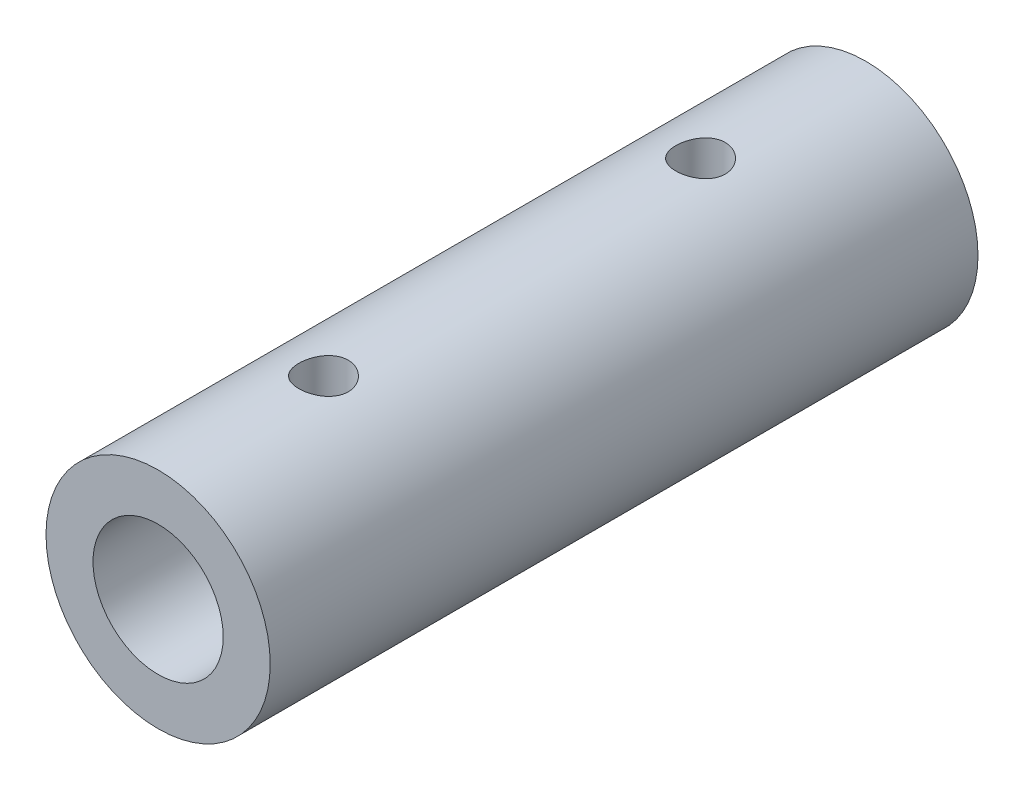
ISO-10303-21;
HEADER;
FILE_DESCRIPTION(('STEP AP214'),'2;1');
FILE_NAME('part.step','',(''),(''),'','','');
FILE_SCHEMA(('AUTOMOTIVE_DESIGN { 1 0 10303 214 1 1 1 1 }'));
ENDSEC;
DATA;
#1=APPLICATION_CONTEXT('core data for automotive mechanical design processes');
#2=APPLICATION_PROTOCOL_DEFINITION('international standard','automotive_design',2000,#1);
#3=PRODUCT_CONTEXT('',#1,'mechanical');
#4=PRODUCT('Part','Part','',(#3));
#5=PRODUCT_RELATED_PRODUCT_CATEGORY('part','',(#4));
#6=PRODUCT_DEFINITION_FORMATION('','',#4);
#7=PRODUCT_DEFINITION_CONTEXT('part definition',#1,'design');
#8=PRODUCT_DEFINITION('design','',#6,#7);
#9=PRODUCT_DEFINITION_SHAPE('','',#8);
#10=(LENGTH_UNIT() NAMED_UNIT(*) SI_UNIT(.MILLI.,.METRE.));
#11=(NAMED_UNIT(*) PLANE_ANGLE_UNIT() SI_UNIT($,.RADIAN.));
#12=(NAMED_UNIT(*) SI_UNIT($,.STERADIAN.) SOLID_ANGLE_UNIT());
#13=UNCERTAINTY_MEASURE_WITH_UNIT(LENGTH_MEASURE(1.E-05),#10,'distance_accuracy_value','');
#14=(GEOMETRIC_REPRESENTATION_CONTEXT(3) GLOBAL_UNCERTAINTY_ASSIGNED_CONTEXT((#13)) GLOBAL_UNIT_ASSIGNED_CONTEXT((#10,
#11,#12)) REPRESENTATION_CONTEXT('',''));
#15=CARTESIAN_POINT('',(0.,0.,0.));
#16=DIRECTION('',(0.,0.,1.));
#17=DIRECTION('',(1.,0.,0.));
#18=AXIS2_PLACEMENT_3D('',#15,#16,#17);
#19=CARTESIAN_POINT('',(0.,0.,54.356));
#20=DIRECTION('',(0.,0.,1.));
#21=DIRECTION('',(1.,0.,0.));
#22=AXIS2_PLACEMENT_3D('',#19,#20,#21);
#23=PLANE('',#22);
#24=CARTESIAN_POINT('',(0.,0.,54.356));
#25=DIRECTION('',(0.,0.,1.));
#26=DIRECTION('',(1.,0.,0.));
#27=AXIS2_PLACEMENT_3D('',#24,#25,#26);
#28=CIRCLE('',#27,8.610000052);
#29=CARTESIAN_POINT('',(8.610000052,0.,54.356));
#30=VERTEX_POINT('',#29);
#31=EDGE_CURVE('E66',#30,#30,#28,.T.);
#32=ORIENTED_EDGE('',*,*,#31,.T.);
#33=EDGE_LOOP('',(#32));
#34=FACE_BOUND('',#33,.T.);
#35=CARTESIAN_POINT('',(0.,0.,54.356));
#36=DIRECTION('',(0.,0.,1.));
#37=DIRECTION('',(1.,0.,0.));
#38=AXIS2_PLACEMENT_3D('',#35,#36,#37);
#39=CIRCLE('',#38,4.999999906);
#40=CARTESIAN_POINT('',(4.999999906,0.,54.356));
#41=VERTEX_POINT('',#40);
#42=EDGE_CURVE('E130',#41,#41,#39,.T.);
#43=ORIENTED_EDGE('',*,*,#42,.F.);
#44=EDGE_LOOP('',(#43));
#45=FACE_BOUND('',#44,.T.);
#46=ADVANCED_FACE('F43',(#34,#45),#23,.T.);
#47=CARTESIAN_POINT('',(0.,0.,0.));
#48=DIRECTION('',(0.,0.,1.));
#49=DIRECTION('',(1.,0.,0.));
#50=AXIS2_PLACEMENT_3D('',#47,#48,#49);
#51=PLANE('',#50);
#52=CARTESIAN_POINT('',(0.,0.,0.));
#53=DIRECTION('',(0.,0.,1.));
#54=DIRECTION('',(1.,0.,0.));
#55=AXIS2_PLACEMENT_3D('',#52,#53,#54);
#56=CIRCLE('',#55,8.610000052);
#57=CARTESIAN_POINT('',(8.610000052,0.,0.));
#58=VERTEX_POINT('',#57);
#59=EDGE_CURVE('E124',#58,#58,#56,.T.);
#60=ORIENTED_EDGE('',*,*,#59,.F.);
#61=EDGE_LOOP('',(#60));
#62=FACE_BOUND('',#61,.T.);
#63=CARTESIAN_POINT('',(0.,0.,0.));
#64=DIRECTION('',(0.,0.,1.));
#65=DIRECTION('',(1.,0.,0.));
#66=AXIS2_PLACEMENT_3D('',#63,#64,#65);
#67=CIRCLE('',#66,4.999999906);
#68=CARTESIAN_POINT('',(4.999999906,0.,0.));
#69=VERTEX_POINT('',#68);
#70=EDGE_CURVE('E127',#69,#69,#67,.T.);
#71=ORIENTED_EDGE('',*,*,#70,.T.);
#72=EDGE_LOOP('',(#71));
#73=FACE_BOUND('',#72,.T.);
#74=ADVANCED_FACE('F113',(#62,#73),#51,.F.);
#75=CARTESIAN_POINT('',(0.,0.,54.356));
#76=DIRECTION('',(0.,0.,-1.));
#77=DIRECTION('',(-1.,0.,0.));
#78=AXIS2_PLACEMENT_3D('',#75,#76,#77);
#79=CYLINDRICAL_SURFACE('',#78,8.610000052);
#80=CARTESIAN_POINT('',(0.,-8.610000052,44.11345));
#81=CARTESIAN_POINT('',(0.135110235487046,-8.60999843787346,44.1134476024806));
#82=CARTESIAN_POINT('',(0.270245136241255,-8.60678896456518,44.1022703393886));
#83=CARTESIAN_POINT('',(0.536598644479173,-8.59429840560888,44.0579504820702));
#84=CARTESIAN_POINT('',(0.667815743718076,-8.58501501239633,44.0247995396824));
#85=CARTESIAN_POINT('',(0.922452183889428,-8.56139719241706,43.9377154809111));
#86=CARTESIAN_POINT('',(1.04588210638935,-8.54706980193344,43.8838113051512));
#87=CARTESIAN_POINT('',(1.28195111823434,-8.51486432246543,43.7568645304906));
#88=CARTESIAN_POINT('',(1.39458908328752,-8.49698586413042,43.6838199405209));
#89=CARTESIAN_POINT('',(1.60883247864422,-8.45907115321718,43.5186441536598));
#90=CARTESIAN_POINT('',(1.71011452866295,-8.43899391197681,43.4261029302473));
#91=CARTESIAN_POINT('',(1.89595301088498,-8.39919721681434,43.2254357970887));
#92=CARTESIAN_POINT('',(1.98050694116524,-8.37947781681234,43.1173075602621));
#93=CARTESIAN_POINT('',(2.13213384884984,-8.34220249619708,42.8858696957101));
#94=CARTESIAN_POINT('',(2.19882239190662,-8.32469787356624,42.7622991747185));
#95=CARTESIAN_POINT('',(2.31034446668434,-8.29444223189009,42.5051179818037));
#96=CARTESIAN_POINT('',(2.35518268905458,-8.28169019273717,42.3715094718686));
#97=CARTESIAN_POINT('',(2.42058456830036,-8.26280891927936,42.1016546530029));
#98=CARTESIAN_POINT('',(2.44174006751581,-8.25651855304008,41.9655633465747));
#99=CARTESIAN_POINT('',(2.46102285204839,-8.25079253424646,41.6916290175342));
#100=CARTESIAN_POINT('',(2.45915512963058,-8.25135539566479,41.5537863811488));
#101=CARTESIAN_POINT('',(2.4329115907966,-8.25912878817347,41.284986037917));
#102=CARTESIAN_POINT('',(2.4092655701133,-8.26612376545237,41.1539498324697));
#103=CARTESIAN_POINT('',(2.34131114051683,-8.28562612800992,40.8977871286055));
#104=CARTESIAN_POINT('',(2.29700086712936,-8.2981340106961,40.7726611645743));
#105=CARTESIAN_POINT('',(2.18841279106031,-8.32743268516131,40.5300331824734));
#106=CARTESIAN_POINT('',(2.12388973977514,-8.34427560158148,40.4126474871901));
#107=CARTESIAN_POINT('',(1.97687837832189,-8.38032019086892,40.1901196222558));
#108=CARTESIAN_POINT('',(1.89438607597686,-8.39952238747676,40.0849801812988));
#109=CARTESIAN_POINT('',(1.71010502466155,-8.43900659057232,39.8857759361051));
#110=CARTESIAN_POINT('',(1.60770729167331,-8.45930204889059,39.7922762699486));
#111=CARTESIAN_POINT('',(1.38843403453033,-8.49804269417671,39.6236514561524));
#112=CARTESIAN_POINT('',(1.27155776363307,-8.51648778562149,39.5485272568375));
#113=CARTESIAN_POINT('',(1.02568681516523,-8.54959176332535,39.41848599062));
#114=CARTESIAN_POINT('',(0.896628249546233,-8.56422898277711,39.3636838365675));
#115=CARTESIAN_POINT('',(0.630613786129785,-8.58791185632248,39.2767239530241));
#116=CARTESIAN_POINT('',(0.493659884002574,-8.59695891670027,39.2445605281548));
#117=CARTESIAN_POINT('',(0.220555049493647,-8.60822405481961,39.2047077344697));
#118=CARTESIAN_POINT('',(0.0845246920708002,-8.61065606338982,39.1962513907367));
#119=CARTESIAN_POINT('',(-0.187015195192118,-8.60903903495696,39.2019173435546));
#120=CARTESIAN_POINT('',(-0.322524785438475,-8.60499077386318,39.2160369369957));
#121=CARTESIAN_POINT('',(-0.586352654071624,-8.59100736009443,39.2658294269295));
#122=CARTESIAN_POINT('',(-0.714760735224726,-8.5811921855351,39.3010633388608));
#123=CARTESIAN_POINT('',(-0.963822748771201,-8.55679956013814,39.3915644636817));
#124=CARTESIAN_POINT('',(-1.0844757833262,-8.5422215590698,39.4468339912884));
#125=CARTESIAN_POINT('',(-1.31749651064028,-8.50943348003594,39.5771852093947));
#126=CARTESIAN_POINT('',(-1.42962872608689,-8.4911517013415,39.6526693426578));
#127=CARTESIAN_POINT('',(-1.63989992678921,-8.45306257497311,39.8208106479166));
#128=CARTESIAN_POINT('',(-1.73803572654746,-8.43325488158527,39.913471718276));
#129=CARTESIAN_POINT('',(-1.92084170557701,-8.39354010485391,40.1169315788528));
#130=CARTESIAN_POINT('',(-2.00496789434801,-8.37365087523657,40.2282236183542));
#131=CARTESIAN_POINT('',(-2.15337670330665,-8.33672236397252,40.4637740500766));
#132=CARTESIAN_POINT('',(-2.21766001676352,-8.31968298276752,40.5880319890929));
#133=CARTESIAN_POINT('',(-2.32408921984882,-8.29058243734992,40.8454695384306));
#134=CARTESIAN_POINT('',(-2.36635265956832,-8.2784949139034,40.9785974045999));
#135=CARTESIAN_POINT('',(-2.42776102610443,-8.26069725314294,41.2504824753168));
#136=CARTESIAN_POINT('',(-2.44691293993981,-8.25498518845546,41.3892379654169));
#137=CARTESIAN_POINT('',(-2.46111137651616,-8.25076233740564,41.6628264083924));
#138=CARTESIAN_POINT('',(-2.45703879547907,-8.25198837752461,41.7976102184914));
#139=CARTESIAN_POINT('',(-2.42697983520207,-8.26087829053974,42.0644843417645));
#140=CARTESIAN_POINT('',(-2.4009941843591,-8.26854194944751,42.1965747443188));
#141=CARTESIAN_POINT('',(-2.32839029768394,-8.28927573653278,42.4530224047454));
#142=CARTESIAN_POINT('',(-2.28198430079094,-8.30229016243034,42.5774445794313));
#143=CARTESIAN_POINT('',(-2.17002119482443,-8.33225373446898,42.8168351999697));
#144=CARTESIAN_POINT('',(-2.10446070223758,-8.34920357566611,42.9318019709866));
#145=CARTESIAN_POINT('',(-1.9534878892542,-8.38583338791318,43.153159349927));
#146=CARTESIAN_POINT('',(-1.86748684990437,-8.40558551321868,43.2591365165472));
#147=CARTESIAN_POINT('',(-1.67916076592766,-8.44522141888343,43.4554408450375));
#148=CARTESIAN_POINT('',(-1.57683161893758,-8.46510523112188,43.5457640619947));
#149=CARTESIAN_POINT('',(-1.35559781639118,-8.50337343733367,43.7104863824259));
#150=CARTESIAN_POINT('',(-1.23633607375684,-8.52170645588591,43.7844189669412));
#151=CARTESIAN_POINT('',(-0.986552704546226,-8.55421721226658,43.9110736487339));
#152=CARTESIAN_POINT('',(-0.856037296273841,-8.56839722606612,43.9638073695504));
#153=CARTESIAN_POINT('',(-0.605292131128479,-8.58949401620546,44.0408571715148));
#154=CARTESIAN_POINT('',(-0.485987265747071,-8.59712370058352,44.0680106286004));
#155=CARTESIAN_POINT('',(-0.24446140330883,-8.60737711535723,44.1043069282104));
#156=CARTESIAN_POINT('',(-0.122240796778708,-8.61000151237873,44.1134521691524));
#157=CARTESIAN_POINT('',(0.,-8.610000052,44.11345));
#158=B_SPLINE_CURVE_WITH_KNOTS('',3,(#80,#81,#82,#83,#84,#85,#86,#87,#88,#89,#90,#91,#92,#93,
#94,#95,#96,#97,#98,#99,#100,#101,#102,#103,#104,#105,#106,#107,#108,#109,#110,#111,#112,#113,
#114,#115,#116,#117,#118,#119,#120,#121,#122,#123,#124,#125,#126,#127,#128,#129,#130,#131,#132,
#133,#134,#135,#136,#137,#138,#139,#140,#141,#142,#143,#144,#145,#146,#147,#148,#149,#150,#151,
#152,#153,#154,#155,#156,#157),.UNSPECIFIED.,.T.,.F.,(4,2,2,2,2,2,2,2,2,2,2,2,2,2,2,2,2,2,2,2,2,
2,2,2,2,2,2,2,2,2,2,2,2,2,2,2,2,2,4),(0.,0.404882020788605,0.80991795113376,1.21439108816756,
1.61890631696577,2.03297497344574,2.44710551291364,2.86953838456116,3.29188053176022,
3.70341458920873,4.11485941279647,4.51299937322733,4.91117526359957,5.31438279728944,
5.71768000196978,6.13614308957469,6.55462776875096,6.97544397238729,7.39615427056462,
7.80308730589802,8.20997162111288,8.60867648164454,9.0074274192847,9.41479793611352,
9.82226102049825,10.2430220954495,10.6637684682106,11.0822451159685,11.5005952191916,
11.9031856446707,12.3057626884522,12.7042508908905,13.102809526202,13.5146492364446,
13.9265925829515,14.3490750115578,14.7713254720157,15.1376907121345,15.5040071547353),.UNSPECIFIED.);
#159=CARTESIAN_POINT('',(0.,-8.610000052,44.11345));
#160=VERTEX_POINT('',#159);
#161=EDGE_CURVE('E10',#160,#160,#158,.T.);
#162=ORIENTED_EDGE('',*,*,#161,.T.);
#163=EDGE_LOOP('',(#162));
#164=FACE_BOUND('',#163,.T.);
#165=CARTESIAN_POINT('',(0.,8.610000052,10.80135));
#166=CARTESIAN_POINT('',(0.105282423967709,8.60999811333202,10.8013535651746));
#167=CARTESIAN_POINT('',(0.210607741396535,8.60804937116556,10.8101366152437));
#168=CARTESIAN_POINT('',(0.418265187752237,8.60046370971147,10.8449994156247));
#169=CARTESIAN_POINT('',(0.520595148325115,8.5948241844162,10.8710913876894));
#170=CARTESIAN_POINT('',(0.719230912876964,8.58048468968561,10.9397139055741));
#171=CARTESIAN_POINT('',(0.81554293741652,8.57178794417312,10.982227139369));
#172=CARTESIAN_POINT('',(0.999663953566136,8.55227195774755,11.0824301147066));
#173=CARTESIAN_POINT('',(1.08747313709988,8.54145276475843,11.1401195135879));
#174=CARTESIAN_POINT('',(1.25352987169506,8.51867942267443,11.2700319083504));
#175=CARTESIAN_POINT('',(1.33161904562148,8.50671100539432,11.3424548611404));
#176=CARTESIAN_POINT('',(1.47464564562941,8.4830883480796,11.4993493346095));
#177=CARTESIAN_POINT('',(1.53958188363856,8.47143413650878,11.5838219425309));
#178=CARTESIAN_POINT('',(1.65516055359782,8.44961858040989,11.7635920243789));
#179=CARTESIAN_POINT('',(1.70563392054591,8.43947551021091,11.8590006103153));
#180=CARTESIAN_POINT('',(1.78976948026943,8.42203565167347,12.057206157304));
#181=CARTESIAN_POINT('',(1.82343371867,8.41473851701608,12.1600022175781));
#182=CARTESIAN_POINT('',(1.87247108317844,8.40396212355281,12.3683453860998));
#183=CARTESIAN_POINT('',(1.88812486054031,8.40042435238324,12.47382334641));
#184=CARTESIAN_POINT('',(1.90156968458316,8.39739154378867,12.6859631123958));
#185=CARTESIAN_POINT('',(1.89936296428083,8.39789600098219,12.7926247684143));
#186=CARTESIAN_POINT('',(1.87737518111768,8.40283769889481,13.0020143577812));
#187=CARTESIAN_POINT('',(1.85792058907767,8.40720187837269,13.1047785595015));
#188=CARTESIAN_POINT('',(1.80250672752471,8.41925572451525,13.3055476997296));
#189=CARTESIAN_POINT('',(1.76654651839497,8.42694558049958,13.4035523669397));
#190=CARTESIAN_POINT('',(1.67884360712381,8.44485605493333,13.5929359353832));
#191=CARTESIAN_POINT('',(1.62697575537806,8.45509661590689,13.6842549156791));
#192=CARTESIAN_POINT('',(1.50901786770477,8.47694246920617,13.8570137005531));
#193=CARTESIAN_POINT('',(1.44292586297509,8.48854795035311,13.9384521350965));
#194=CARTESIAN_POINT('',(1.29666960655667,8.51212916249091,14.0910172334709));
#195=CARTESIAN_POINT('',(1.2162278552335,8.52410742319792,14.1618777481698));
#196=CARTESIAN_POINT('',(1.04446655699098,8.54685225570169,14.2891463527741));
#197=CARTESIAN_POINT('',(0.953146806741693,8.55761880484199,14.3455541724697));
#198=CARTESIAN_POINT('',(0.761893937788416,8.57676297038531,14.4423836338736));
#199=CARTESIAN_POINT('',(0.661942372038452,8.58513529693755,14.4827699523298));
#200=CARTESIAN_POINT('',(0.456445799026004,8.59850842278644,14.5460997325734));
#201=CARTESIAN_POINT('',(0.350901621285715,8.60350972058827,14.5690457734799));
#202=CARTESIAN_POINT('',(0.139498379534734,8.60950617009743,14.5964554948651));
#203=CARTESIAN_POINT('',(0.0336886170886337,8.61058010098827,14.6012826750786));
#204=CARTESIAN_POINT('',(-0.177225458159257,8.6088217689155,14.5933035296943));
#205=CARTESIAN_POINT('',(-0.282329819134173,8.60598977547902,14.5804984208072));
#206=CARTESIAN_POINT('',(-0.487642008430828,8.59678756118083,14.5379195224936));
#207=CARTESIAN_POINT('',(-0.587891407265301,8.59045720153258,14.5083368032034));
#208=CARTESIAN_POINT('',(-0.782004911865495,8.57496698955335,14.4332548397273));
#209=CARTESIAN_POINT('',(-0.875868466692472,8.56580689346364,14.3877542242995));
#210=CARTESIAN_POINT('',(-1.05604587278676,8.54547922212635,14.2813735716998));
#211=CARTESIAN_POINT('',(-1.14223082994206,8.5342845171704,14.2202805258222));
#212=CARTESIAN_POINT('',(-1.30325591748071,8.51118403478381,14.0847292605493));
#213=CARTESIAN_POINT('',(-1.37809454612002,8.4992781635169,14.0102692748154));
#214=CARTESIAN_POINT('',(-1.51574305200032,8.47582447649938,13.8484285636673));
#215=CARTESIAN_POINT('',(-1.57830102599006,8.46428756286024,13.7608317150569));
#216=CARTESIAN_POINT('',(-1.68781947754207,8.44313271481403,13.5761618694889));
#217=CARTESIAN_POINT('',(-1.73478063351321,8.43351469694873,13.4790892849314));
#218=CARTESIAN_POINT('',(-1.81145275115654,8.41737941266761,13.2787459309041));
#219=CARTESIAN_POINT('',(-1.84126126718999,8.41084464952885,13.1755139747427));
#220=CARTESIAN_POINT('',(-1.88306652655597,8.40158486273038,12.9653434852814));
#221=CARTESIAN_POINT('',(-1.89506617214383,8.39885921831486,12.8584055588393));
#222=CARTESIAN_POINT('',(-1.90078797415552,8.39756584736436,12.6463997481163));
#223=CARTESIAN_POINT('',(-1.89490968911294,8.39890722383784,12.5413430055343));
#224=CARTESIAN_POINT('',(-1.86593688073885,8.40539093738595,12.333756653401));
#225=CARTESIAN_POINT('',(-1.84284256722809,8.41053322813683,12.2312270130663));
#226=CARTESIAN_POINT('',(-1.78028773181278,8.42399469815741,12.0319290004177));
#227=CARTESIAN_POINT('',(-1.74088626878374,8.43230240485053,11.9351412645743));
#228=CARTESIAN_POINT('',(-1.64688599636683,8.45116295836884,11.7494910284576));
#229=CARTESIAN_POINT('',(-1.59228557378437,8.46171604348708,11.6606293707689));
#230=CARTESIAN_POINT('',(-1.46811596253354,8.48414915161104,11.4913861392531));
#231=CARTESIAN_POINT('',(-1.39826241650078,8.49605197305515,11.4112161737778));
#232=CARTESIAN_POINT('',(-1.24614454147193,8.51969119076192,11.2636050924168));
#233=CARTESIAN_POINT('',(-1.16387734459835,8.53142754787974,11.196166926035));
#234=CARTESIAN_POINT('',(-0.987955273489512,8.55359575023221,11.0750784231663));
#235=CARTESIAN_POINT('',(-0.894164106741991,8.56400827673821,11.0216223593719));
#236=CARTESIAN_POINT('',(-0.698717343847975,8.58216133429937,10.9313186041776));
#237=CARTESIAN_POINT('',(-0.597068375544788,8.5899040877716,10.8944570910139));
#238=CARTESIAN_POINT('',(-0.41277655996068,8.60047625352117,10.8449000825776));
#239=CARTESIAN_POINT('',(-0.331124979079468,8.60402543015327,10.8286001762217));
#240=CARTESIAN_POINT('',(-0.166324476867508,8.60878804181377,10.8068239739854));
#241=CARTESIAN_POINT('',(-0.0831756241459135,8.61000158359391,10.8013471834271));
#242=CARTESIAN_POINT('',(0.,8.610000052,10.80135));
#243=B_SPLINE_CURVE_WITH_KNOTS('',3,(#165,#166,#167,#168,#169,#170,#171,#172,#173,#174,#175,
#176,#177,#178,#179,#180,#181,#182,#183,#184,#185,#186,#187,#188,#189,#190,#191,#192,#193,#194,
#195,#196,#197,#198,#199,#200,#201,#202,#203,#204,#205,#206,#207,#208,#209,#210,#211,#212,#213,
#214,#215,#216,#217,#218,#219,#220,#221,#222,#223,#224,#225,#226,#227,#228,#229,#230,#231,#232,
#233,#234,#235,#236,#237,#238,#239,#240,#241,#242),.UNSPECIFIED.,.T.,.F.,(4,2,2,2,2,2,2,2,2,2,2,
2,2,2,2,2,2,2,2,2,2,2,2,2,2,2,2,2,2,2,2,2,2,2,2,2,2,2,4),(0.,0.31554279722232,0.631308635297217,
0.946742483574757,1.26216921030953,1.58220272526634,1.9022651351849,2.22592908401172,
2.54955363421196,2.86806387165592,3.18653428783056,3.49910235499884,3.81168821796569,
4.12679925597287,4.44195393740396,4.76403916326981,5.08613041044964,5.40892789033121,
5.73167762468735,6.0479166579306,6.36413387028656,6.6768201771624,6.98953342693099,
7.30677153586495,7.62405159628278,7.947281806446,8.27049795534575,8.59185718976975,
8.91316404754184,9.22734310463676,9.54151833272955,9.85456554736162,10.1676460010291,
10.4871555125838,10.8067389525139,11.1305516266044,11.454094092675,11.7033918174488,
11.9526781476321),.UNSPECIFIED.);
#244=CARTESIAN_POINT('',(0.,8.610000052,10.80135));
#245=VERTEX_POINT('',#244);
#246=EDGE_CURVE('E56',#245,#245,#243,.T.);
#247=ORIENTED_EDGE('',*,*,#246,.T.);
#248=EDGE_LOOP('',(#247));
#249=FACE_BOUND('',#248,.T.);
#250=CARTESIAN_POINT('',(0.,8.610000052,39.75735));
#251=CARTESIAN_POINT('',(0.105282423967709,8.60999811333202,39.7573535651746));
#252=CARTESIAN_POINT('',(0.210607741396535,8.60804937116556,39.7661366152437));
#253=CARTESIAN_POINT('',(0.418265187752237,8.60046370971147,39.8009994156247));
#254=CARTESIAN_POINT('',(0.520595148325114,8.5948241844162,39.8270913876894));
#255=CARTESIAN_POINT('',(0.719230912876964,8.58048468968561,39.8957139055741));
#256=CARTESIAN_POINT('',(0.815542937416522,8.57178794417312,39.938227139369));
#257=CARTESIAN_POINT('',(0.999663953566138,8.55227195774755,40.0384301147066));
#258=CARTESIAN_POINT('',(1.08747313709989,8.54145276475843,40.0961195135879));
#259=CARTESIAN_POINT('',(1.25352987169506,8.51867942267443,40.2260319083504));
#260=CARTESIAN_POINT('',(1.33161904562148,8.50671100539432,40.2984548611404));
#261=CARTESIAN_POINT('',(1.4746456456294,8.4830883480796,40.4553493346095));
#262=CARTESIAN_POINT('',(1.53958188363856,8.47143413650878,40.5398219425309));
#263=CARTESIAN_POINT('',(1.65516055359782,8.44961858040989,40.7195920243789));
#264=CARTESIAN_POINT('',(1.70563392054591,8.43947551021091,40.8150006103153));
#265=CARTESIAN_POINT('',(1.78976948026943,8.42203565167347,41.0132061573039));
#266=CARTESIAN_POINT('',(1.82343371867,8.41473851701608,41.1160022175781));
#267=CARTESIAN_POINT('',(1.87247108317844,8.40396212355281,41.3243453860998));
#268=CARTESIAN_POINT('',(1.88812486054031,8.40042435238324,41.42982334641));
#269=CARTESIAN_POINT('',(1.90156968458317,8.39739154378867,41.6419631123958));
#270=CARTESIAN_POINT('',(1.89936296428083,8.39789600098219,41.7486247684143));
#271=CARTESIAN_POINT('',(1.87737518111768,8.40283769889481,41.9580143577812));
#272=CARTESIAN_POINT('',(1.85792058907767,8.40720187837269,42.0607785595015));
#273=CARTESIAN_POINT('',(1.80250672752471,8.41925572451525,42.2615476997296));
#274=CARTESIAN_POINT('',(1.76654651839497,8.42694558049958,42.3595523669397));
#275=CARTESIAN_POINT('',(1.67884360712381,8.44485605493333,42.5489359353832));
#276=CARTESIAN_POINT('',(1.62697575537806,8.45509661590689,42.6402549156791));
#277=CARTESIAN_POINT('',(1.50901786770477,8.47694246920617,42.8130137005531));
#278=CARTESIAN_POINT('',(1.44292586297509,8.48854795035311,42.8944521350965));
#279=CARTESIAN_POINT('',(1.29666960655666,8.51212916249092,43.0470172334709));
#280=CARTESIAN_POINT('',(1.2162278552335,8.52410742319793,43.1178777481698));
#281=CARTESIAN_POINT('',(1.04446655699098,8.54685225570169,43.2451463527741));
#282=CARTESIAN_POINT('',(0.95314680674169,8.557618804842,43.3015541724697));
#283=CARTESIAN_POINT('',(0.761893937788413,8.57676297038531,43.3983836338736));
#284=CARTESIAN_POINT('',(0.661942372038449,8.58513529693755,43.4387699523298));
#285=CARTESIAN_POINT('',(0.456445799026001,8.59850842278644,43.5020997325734));
#286=CARTESIAN_POINT('',(0.350901621285713,8.60350972058827,43.5250457734799));
#287=CARTESIAN_POINT('',(0.139498379534734,8.60950617009743,43.5524554948651));
#288=CARTESIAN_POINT('',(0.0336886170886331,8.61058010098827,43.5572826750786));
#289=CARTESIAN_POINT('',(-0.177225458159257,8.6088217689155,43.5493035296943));
#290=CARTESIAN_POINT('',(-0.282329819134172,8.60598977547902,43.5364984208072));
#291=CARTESIAN_POINT('',(-0.487642008430827,8.59678756118083,43.4939195224936));
#292=CARTESIAN_POINT('',(-0.587891407265301,8.59045720153258,43.4643368032034));
#293=CARTESIAN_POINT('',(-0.782004911865495,8.57496698955335,43.3892548397273));
#294=CARTESIAN_POINT('',(-0.875868466692472,8.56580689346364,43.3437542242995));
#295=CARTESIAN_POINT('',(-1.05604587278676,8.54547922212635,43.2373735716998));
#296=CARTESIAN_POINT('',(-1.14223082994206,8.5342845171704,43.1762805258222));
#297=CARTESIAN_POINT('',(-1.30325591748071,8.51118403478381,43.0407292605493));
#298=CARTESIAN_POINT('',(-1.37809454612002,8.4992781635169,42.9662692748154));
#299=CARTESIAN_POINT('',(-1.51574305200032,8.47582447649938,42.8044285636673));
#300=CARTESIAN_POINT('',(-1.57830102599006,8.46428756286024,42.7168317150569));
#301=CARTESIAN_POINT('',(-1.68781947754207,8.44313271481403,42.5321618694889));
#302=CARTESIAN_POINT('',(-1.73478063351321,8.43351469694873,42.4350892849315));
#303=CARTESIAN_POINT('',(-1.81145275115654,8.41737941266761,42.2347459309041));
#304=CARTESIAN_POINT('',(-1.84126126718999,8.41084464952885,42.1315139747427));
#305=CARTESIAN_POINT('',(-1.88306652655597,8.40158486273038,41.9213434852814));
#306=CARTESIAN_POINT('',(-1.89506617214383,8.39885921831486,41.8144055588393));
#307=CARTESIAN_POINT('',(-1.90078797415552,8.39756584736435,41.6023997481163));
#308=CARTESIAN_POINT('',(-1.89490968911294,8.39890722383784,41.4973430055343));
#309=CARTESIAN_POINT('',(-1.86593688073885,8.40539093738595,41.289756653401));
#310=CARTESIAN_POINT('',(-1.84284256722809,8.41053322813683,41.1872270130663));
#311=CARTESIAN_POINT('',(-1.78028773181278,8.42399469815741,40.9879290004177));
#312=CARTESIAN_POINT('',(-1.74088626878374,8.43230240485053,40.8911412645743));
#313=CARTESIAN_POINT('',(-1.64688599636683,8.45116295836884,40.7054910284576));
#314=CARTESIAN_POINT('',(-1.59228557378437,8.46171604348708,40.6166293707689));
#315=CARTESIAN_POINT('',(-1.46811596253354,8.48414915161104,40.4473861392531));
#316=CARTESIAN_POINT('',(-1.39826241650078,8.49605197305515,40.3672161737778));
#317=CARTESIAN_POINT('',(-1.24614454147193,8.51969119076192,40.2196050924168));
#318=CARTESIAN_POINT('',(-1.16387734459835,8.53142754787974,40.152166926035));
#319=CARTESIAN_POINT('',(-0.987955273489519,8.55359575023221,40.0310784231663));
#320=CARTESIAN_POINT('',(-0.894164106741997,8.56400827673821,39.9776223593719));
#321=CARTESIAN_POINT('',(-0.698717343847979,8.58216133429937,39.8873186041776));
#322=CARTESIAN_POINT('',(-0.597068375544792,8.5899040877716,39.8504570910139));
#323=CARTESIAN_POINT('',(-0.412776559960682,8.60047625352117,39.8009000825776));
#324=CARTESIAN_POINT('',(-0.33112497907947,8.60402543015327,39.7846001762217));
#325=CARTESIAN_POINT('',(-0.166324476867509,8.60878804181377,39.7628239739854));
#326=CARTESIAN_POINT('',(-0.083175624145914,8.61000158359391,39.7573471834271));
#327=CARTESIAN_POINT('',(0.,8.610000052,39.75735));
#328=B_SPLINE_CURVE_WITH_KNOTS('',3,(#250,#251,#252,#253,#254,#255,#256,#257,#258,#259,#260,
#261,#262,#263,#264,#265,#266,#267,#268,#269,#270,#271,#272,#273,#274,#275,#276,#277,#278,#279,
#280,#281,#282,#283,#284,#285,#286,#287,#288,#289,#290,#291,#292,#293,#294,#295,#296,#297,#298,
#299,#300,#301,#302,#303,#304,#305,#306,#307,#308,#309,#310,#311,#312,#313,#314,#315,#316,#317,
#318,#319,#320,#321,#322,#323,#324,#325,#326,#327),.UNSPECIFIED.,.T.,.F.,(4,2,2,2,2,2,2,2,2,2,2,
2,2,2,2,2,2,2,2,2,2,2,2,2,2,2,2,2,2,2,2,2,2,2,2,2,2,2,4),(0.,0.31554279722232,0.631308635297219,
0.94674248357476,1.26216921030953,1.58220272526634,1.9022651351849,2.22592908401172,
2.54955363421197,2.86806387165593,3.18653428783057,3.49910235499884,3.81168821796569,
4.12679925597286,4.44195393740396,4.76403916326982,5.08613041044965,5.40892789033122,
5.73167762468735,6.0479166579306,6.36413387028657,6.6768201771624,6.98953342693099,
7.30677153586495,7.62405159628278,7.947281806446,8.27049795534576,8.59185718976976,
8.91316404754184,9.22734310463677,9.54151833272956,9.85456554736162,10.1676460010291,
10.4871555125838,10.8067389525139,11.1305516266044,11.454094092675,11.7033918174488,
11.9526781476321),.UNSPECIFIED.);
#329=CARTESIAN_POINT('',(0.,8.610000052,39.75735));
#330=VERTEX_POINT('',#329);
#331=EDGE_CURVE('E61',#330,#330,#328,.T.);
#332=ORIENTED_EDGE('',*,*,#331,.T.);
#333=EDGE_LOOP('',(#332));
#334=FACE_BOUND('',#333,.T.);
#335=ORIENTED_EDGE('',*,*,#31,.F.);
#336=EDGE_LOOP('',(#335));
#337=FACE_BOUND('',#336,.T.);
#338=ORIENTED_EDGE('',*,*,#59,.T.);
#339=EDGE_LOOP('',(#338));
#340=FACE_BOUND('',#339,.T.);
#341=ADVANCED_FACE('F45',(#164,#249,#334,#337,#340),#79,.T.);
#342=CARTESIAN_POINT('',(0.,0.,54.356));
#343=DIRECTION('',(0.,0.,-1.));
#344=DIRECTION('',(-1.,0.,0.));
#345=AXIS2_PLACEMENT_3D('',#342,#343,#344);
#346=CYLINDRICAL_SURFACE('',#345,4.999999906);
#347=CARTESIAN_POINT('',(0.,-4.999999906,44.11345));
#348=CARTESIAN_POINT('',(0.12945218020378,-4.99999209835558,44.1134407617215));
#349=CARTESIAN_POINT('',(0.259071772174057,-4.99491772747102,44.1031601786075));
#350=CARTESIAN_POINT('',(0.514493790795429,-4.97511701905658,44.0624816042436));
#351=CARTESIAN_POINT('',(0.640288127568148,-4.9603715377536,44.03204371083));
#352=CARTESIAN_POINT('',(0.883975356909701,-4.9227766083906,43.95252122702));
#353=CARTESIAN_POINT('',(1.00189658127098,-4.89995831361581,43.9035082674205));
#354=CARTESIAN_POINT('',(1.22767523440914,-4.84832388150094,43.7885889375893));
#355=CARTESIAN_POINT('',(1.33553367987178,-4.81950835103983,43.7226842765254));
#356=CARTESIAN_POINT('',(1.54528982321145,-4.75654990376947,43.571419822218));
#357=CARTESIAN_POINT('',(1.64645972447847,-4.72219291029909,43.4851411797401));
#358=CARTESIAN_POINT('',(1.83356004159706,-4.65274488666919,43.2975510368126));
#359=CARTESIAN_POINT('',(1.91947926429538,-4.61765333833106,43.1962285943893));
#360=CARTESIAN_POINT('',(2.0800294274392,-4.54771443099095,42.9723897338825));
#361=CARTESIAN_POINT('',(2.153347932515,-4.51307880160722,42.8488581061486));
#362=CARTESIAN_POINT('',(2.27785799442183,-4.45154111393004,42.5893253507018));
#363=CARTESIAN_POINT('',(2.32906495339592,-4.42463367683244,42.4533329830131));
#364=CARTESIAN_POINT('',(2.40463463364783,-4.38400345722111,42.1809398980956));
#365=CARTESIAN_POINT('',(2.43040184589876,-4.36959695861025,42.0450358188314));
#366=CARTESIAN_POINT('',(2.45867411121335,-4.35375861524296,41.770132512544));
#367=CARTESIAN_POINT('',(2.46120078671196,-4.35231471043186,41.6311362831256));
#368=CARTESIAN_POINT('',(2.44395287034409,-4.36201115244038,41.3711029768625));
#369=CARTESIAN_POINT('',(2.42670025972623,-4.37172862337546,41.2498328821496));
#370=CARTESIAN_POINT('',(2.3747376949281,-4.40016910977722,41.0121977939587));
#371=CARTESIAN_POINT('',(2.3400224852955,-4.41889483624719,40.8958342885754));
#372=CARTESIAN_POINT('',(2.25347120814685,-4.46366179648952,40.6680049162122));
#373=CARTESIAN_POINT('',(2.20125471252807,-4.48986346462188,40.5567165756154));
#374=CARTESIAN_POINT('',(2.08147113381671,-4.54663229207658,40.3439557095784));
#375=CARTESIAN_POINT('',(2.01389717973615,-4.57720140312995,40.2424876068133));
#376=CARTESIAN_POINT('',(1.8556990874738,-4.64377007832595,40.0392178705828));
#377=CARTESIAN_POINT('',(1.7632687986025,-4.67997722919084,39.9388850496678));
#378=CARTESIAN_POINT('',(1.56271863036396,-4.75070693851724,39.7545448407464));
#379=CARTESIAN_POINT('',(1.45459176862999,-4.78522873809687,39.6705447572016));
#380=CARTESIAN_POINT('',(1.21974453409293,-4.85053518969909,39.5178401564711));
#381=CARTESIAN_POINT('',(1.09242024050735,-4.88109216745563,39.4499592228016));
#382=CARTESIAN_POINT('',(0.826275376126997,-4.93311200093717,39.3371265015567));
#383=CARTESIAN_POINT('',(0.687463737720887,-4.95458184470556,39.2921570894845));
#384=CARTESIAN_POINT('',(0.414333261569889,-4.98454145871059,39.2300178582289));
#385=CARTESIAN_POINT('',(0.280559893729544,-4.99394103448158,39.2108928638337));
#386=CARTESIAN_POINT('',(0.0113914609102067,-5.00179609060187,39.1948859389749));
#387=CARTESIAN_POINT('',(-0.124002846504827,-5.00025649835459,39.197993993933));
#388=CARTESIAN_POINT('',(-0.381880446637751,-4.98694390773024,39.2252003418662));
#389=CARTESIAN_POINT('',(-0.504575425521124,-4.97593998184679,39.2477214282837));
#390=CARTESIAN_POINT('',(-0.744209896472175,-4.94578020480806,39.3106718114807));
#391=CARTESIAN_POINT('',(-0.861148742597686,-4.92662344107315,39.3511031130425));
#392=CARTESIAN_POINT('',(-1.08989960101575,-4.88120091444846,39.449836506496));
#393=CARTESIAN_POINT('',(-1.20146144560511,-4.85474352343556,39.5086269338848));
#394=CARTESIAN_POINT('',(-1.41351390708578,-4.7972977198323,39.6418654151667));
#395=CARTESIAN_POINT('',(-1.51399971650488,-4.76630735321124,39.7163202276076));
#396=CARTESIAN_POINT('',(-1.71122788560974,-4.69931428676164,39.8870020634831));
#397=CARTESIAN_POINT('',(-1.80669356580629,-4.66311565709544,39.9846301819875));
#398=CARTESIAN_POINT('',(-1.9804405960162,-4.59202405765136,40.1946622245141));
#399=CARTESIAN_POINT('',(-2.05871104701692,-4.55713192753917,40.3070754481762));
#400=CARTESIAN_POINT('',(-2.1990574608494,-4.49115055421223,40.5497902159817));
#401=CARTESIAN_POINT('',(-2.26026809119631,-4.46029655947914,40.6806616445523));
#402=CARTESIAN_POINT('',(-2.3591419965552,-4.40880974020419,40.9528591057362));
#403=CARTESIAN_POINT('',(-2.39683457838394,-4.38816420116997,41.0941718802337));
#404=CARTESIAN_POINT('',(-2.44421184558577,-4.36193704985441,41.3688856474924));
#405=CARTESIAN_POINT('',(-2.45621322650126,-4.35511276370126,41.5017664295613));
#406=CARTESIAN_POINT('',(-2.4585031854306,-4.35382280974262,41.7677528102271));
#407=CARTESIAN_POINT('',(-2.44880017013682,-4.35935235696649,41.9008583018336));
#408=CARTESIAN_POINT('',(-2.41010361418194,-4.38084567147814,42.1510265977133));
#409=CARTESIAN_POINT('',(-2.38290754075147,-4.39583495475831,42.2684615024386));
#410=CARTESIAN_POINT('',(-2.31216565303098,-4.43345063018403,42.4969929070589));
#411=CARTESIAN_POINT('',(-2.26861470775734,-4.45607941883215,42.6080874051764));
#412=CARTESIAN_POINT('',(-2.16310608593971,-4.50828668979955,42.8290377802234));
#413=CARTESIAN_POINT('',(-2.10010751680687,-4.5382301994622,42.9383079257679));
#414=CARTESIAN_POINT('',(-1.95867388495362,-4.60104164092877,43.1454307993554));
#415=CARTESIAN_POINT('',(-1.88023095737762,-4.63391105802427,43.243277669622));
#416=CARTESIAN_POINT('',(-1.69944938903337,-4.70343291185773,43.4365610347416));
#417=CARTESIAN_POINT('',(-1.59539491105265,-4.74008224977788,43.5304036637281));
#418=CARTESIAN_POINT('',(-1.37198202731643,-4.80950781428313,43.6996208556792));
#419=CARTESIAN_POINT('',(-1.25261573307662,-4.84228202760146,43.7749858404807));
#420=CARTESIAN_POINT('',(-1.00068302665637,-4.90054305320949,43.9049526312397));
#421=CARTESIAN_POINT('',(-0.868072168818394,-4.926004135884,43.959481346385));
#422=CARTESIAN_POINT('',(-0.662799960242063,-4.95636101054928,44.0234690074633));
#423=CARTESIAN_POINT('',(-0.593369031485217,-4.96517063388804,44.0418238105376));
#424=CARTESIAN_POINT('',(-0.452891337863916,-4.9799455294137,44.0724237117176));
#425=CARTESIAN_POINT('',(-0.381845610920491,-4.98591257737981,44.0846726244436));
#426=CARTESIAN_POINT('',(-0.258934764112635,-4.99355641864663,44.1003196082723));
#427=CARTESIAN_POINT('',(-0.207302778989942,-4.99596819477205,44.1052388086239));
#428=CARTESIAN_POINT('',(-0.103789506286649,-4.99919152533986,44.1118059006845));
#429=CARTESIAN_POINT('',(-0.0519082120377088,-5.00000303673802,44.1134537043989));
#430=CARTESIAN_POINT('',(0.,-4.999999906,44.11345));
#431=B_SPLINE_CURVE_WITH_KNOTS('',3,(#347,#348,#349,#350,#351,#352,#353,#354,#355,#356,#357,
#358,#359,#360,#361,#362,#363,#364,#365,#366,#367,#368,#369,#370,#371,#372,#373,#374,#375,#376,
#377,#378,#379,#380,#381,#382,#383,#384,#385,#386,#387,#388,#389,#390,#391,#392,#393,#394,#395,
#396,#397,#398,#399,#400,#401,#402,#403,#404,#405,#406,#407,#408,#409,#410,#411,#412,#413,#414,
#415,#416,#417,#418,#419,#420,#421,#422,#423,#424,#425,#426,#427,#428,#429,#430),.UNSPECIFIED.,
.T.,.F.,(4,2,2,2,2,2,2,2,2,2,2,2,2,2,2,2,2,2,2,2,2,2,2,2,2,2,2,2,2,2,2,2,2,2,2,2,2,2,2,2,2,4),
(0.,0.388154668911784,0.777080010760269,1.16452055903308,1.55192192003579,1.96219358338148,
2.37276512940116,2.81383189632313,3.2545909337326,3.66936780647455,4.08375874173877,
4.45067117329982,4.81769409502935,5.19327714209757,5.56902855847431,5.99061013972359,
6.41237983266806,6.85248301902052,7.29224714657806,7.69642354759545,8.10041790424896,
8.47438655581177,8.84839707819013,9.23335238675599,9.61847412982026,10.0404207198209,
10.4626339894457,10.9034473828507,11.3437103575015,11.7422302459235,12.1405958036774,
12.5034357009727,12.8663895265841,13.2537520485326,13.6413123428282,14.073793113907,
14.5064975961145,14.9407063095103,15.1574975820493,15.3741532451951,15.5297927476862,
15.6854364365416),.UNSPECIFIED.);
#432=CARTESIAN_POINT('',(0.,-4.999999906,44.11345));
#433=VERTEX_POINT('',#432);
#434=EDGE_CURVE('E97',#433,#433,#431,.T.);
#435=ORIENTED_EDGE('',*,*,#434,.F.);
#436=EDGE_LOOP('',(#435));
#437=FACE_BOUND('',#436,.T.);
#438=CARTESIAN_POINT('',(0.,4.999999906,10.80135));
#439=CARTESIAN_POINT('',(0.102732208250962,5.00000302380544,10.8013458754885));
#440=CARTESIAN_POINT('',(0.205436544032141,4.99680639638881,10.8097138600744));
#441=CARTESIAN_POINT('',(0.407770820285334,4.98437454428364,10.8428251301381));
#442=CARTESIAN_POINT('',(0.507401285732958,4.97514035677435,10.8675656030308));
#443=CARTESIAN_POINT('',(0.700640172666429,4.95162306632196,10.9324172946319));
#444=CARTESIAN_POINT('',(0.794259973899714,4.9373498579646,10.9724984034588));
#445=CARTESIAN_POINT('',(0.97343861214487,4.90517207273757,11.066738438786));
#446=CARTESIAN_POINT('',(1.05899522155772,4.8872664966443,11.1209012401589));
#447=CARTESIAN_POINT('',(1.22333092330436,4.84880018866277,11.2442198118628));
#448=CARTESIAN_POINT('',(1.30171411947467,4.82816300551449,11.3138790788776));
#449=CARTESIAN_POINT('',(1.44600660110252,4.78693070642935,11.4651443598583));
#450=CARTESIAN_POINT('',(1.51191192635791,4.76633560589322,11.5467541521333));
#451=CARTESIAN_POINT('',(1.63192749861518,4.72662370874669,11.7235093736769));
#452=CARTESIAN_POINT('',(1.68547302454583,4.70759670610073,11.8190604495753));
#453=CARTESIAN_POINT('',(1.77555729931928,4.67436819126491,12.0186475171206));
#454=CARTESIAN_POINT('',(1.81210303747538,4.66016469658166,12.1226800009986));
#455=CARTESIAN_POINT('',(1.86557833175443,4.63901035995693,12.33171516752));
#456=CARTESIAN_POINT('',(1.88326480242992,4.63178087654532,12.4364950516521));
#457=CARTESIAN_POINT('',(1.90088583777024,4.6245791080471,12.6477657660567));
#458=CARTESIAN_POINT('',(1.90082797484062,4.62460372726744,12.7542558471009));
#459=CARTESIAN_POINT('',(1.88353977645893,4.63166761336856,12.9589363223677));
#460=CARTESIAN_POINT('',(1.86736775375337,4.63827457470193,13.0572338188353));
#461=CARTESIAN_POINT('',(1.82006265298113,4.65703893587297,13.2495981869189));
#462=CARTESIAN_POINT('',(1.78892726298779,4.66919719340347,13.3436644023208));
#463=CARTESIAN_POINT('',(1.71201080287928,4.69794906956255,13.5270237665514));
#464=CARTESIAN_POINT('',(1.66595980241499,4.71462342737166,13.6161904643349));
#465=CARTESIAN_POINT('',(1.56070772076473,4.75050271709778,13.7858345080398));
#466=CARTESIAN_POINT('',(1.50150201917253,4.7697085371893,13.8663087860737));
#467=CARTESIAN_POINT('',(1.36680881386904,4.8101040855007,14.0221298954243));
#468=CARTESIAN_POINT('',(1.29047931651773,4.83133922926697,14.0967389385174));
#469=CARTESIAN_POINT('',(1.12615065726596,4.87226297854516,14.2323201015403));
#470=CARTESIAN_POINT('',(1.03814961330152,4.8919513338168,14.2932900178601));
#471=CARTESIAN_POINT('',(0.851055197256385,4.92797246115701,14.4007037988535));
#472=CARTESIAN_POINT('',(0.75180509505452,4.94424564304562,14.4468960813848));
#473=CARTESIAN_POINT('',(0.546170367368441,4.9711593392686,14.5216816466438));
#474=CARTESIAN_POINT('',(0.439789019084855,4.98180242121955,14.5502829527357));
#475=CARTESIAN_POINT('',(0.229116330834213,4.99580230500623,14.5876427114034));
#476=CARTESIAN_POINT('',(0.125025165357977,4.99952336927723,14.5973942960168));
#477=CARTESIAN_POINT('',(-0.0833610256566535,5.00038964751272,14.5996771270844));
#478=CARTESIAN_POINT('',(-0.187655999185447,4.99753636367497,14.5922123073797));
#479=CARTESIAN_POINT('',(-0.389158946268233,4.98581458480526,14.561024716061));
#480=CARTESIAN_POINT('',(-0.486484005993222,4.97718880813218,14.5379575776535));
#481=CARTESIAN_POINT('',(-0.675810087671594,4.95503494502447,14.477088719555));
#482=CARTESIAN_POINT('',(-0.76781041614543,4.94150622170113,14.4392850855572));
#483=CARTESIAN_POINT('',(-0.94693481792751,4.91037950930946,14.3488035811997));
#484=CARTESIAN_POINT('',(-1.03383340824993,4.89267275281461,14.2957178962949));
#485=CARTESIAN_POINT('',(-1.19778338296029,4.85514150198751,14.1766384946553));
#486=CARTESIAN_POINT('',(-1.27483105009179,4.83531621337503,14.1106399288619));
#487=CARTESIAN_POINT('',(-1.42169091144571,4.79426246188996,13.9629891555732));
#488=CARTESIAN_POINT('',(-1.49079963280834,4.77302070794811,13.8806391154871));
#489=CARTESIAN_POINT('',(-1.61436231574939,4.7326599892278,13.7051002475532));
#490=CARTESIAN_POINT('',(-1.66881477755252,4.71354124181416,13.6119103118552));
#491=CARTESIAN_POINT('',(-1.76162293594858,4.67965275874899,13.416458385438));
#492=CARTESIAN_POINT('',(-1.79989540938765,4.66490562211472,13.3141526909509));
#493=CARTESIAN_POINT('',(-1.85841007371171,4.6419089353562,13.1038297761928));
#494=CARTESIAN_POINT('',(-1.87866380811262,4.63365522567888,12.9958162596399));
#495=CARTESIAN_POINT('',(-1.89952077541859,4.62514159527384,12.7847881287206));
#496=CARTESIAN_POINT('',(-1.90132752461356,4.62439214895992,12.6819112734622));
#497=CARTESIAN_POINT('',(-1.88833692835321,4.62971178248992,12.4774009111013));
#498=CARTESIAN_POINT('',(-1.87354124199157,4.63578018102162,12.3757672807882));
#499=CARTESIAN_POINT('',(-1.82871171788488,4.65363965010115,12.1799457568904));
#500=CARTESIAN_POINT('',(-1.79918221396432,4.66524079125612,12.0856235826785));
#501=CARTESIAN_POINT('',(-1.72617249820674,4.69274352127142,11.9032203499506));
#502=CARTESIAN_POINT('',(-1.68268871815246,4.70864620990741,11.8151408947872));
#503=CARTESIAN_POINT('',(-1.58031377483824,4.74401574000617,11.6426105994324));
#504=CARTESIAN_POINT('',(-1.52072419995513,4.76362749976818,11.558604272196));
#505=CARTESIAN_POINT('',(-1.38889894722194,4.80371744951866,11.4013997368879));
#506=CARTESIAN_POINT('',(-1.31665919864513,4.82419591679336,11.3282050219278));
#507=CARTESIAN_POINT('',(-1.15674681169386,4.86509082912016,11.1905136138937));
#508=CARTESIAN_POINT('',(-1.06843608292315,4.8854394544263,11.1267344524088));
#509=CARTESIAN_POINT('',(-0.881633128545847,4.92257901562842,11.0149350916037));
#510=CARTESIAN_POINT('',(-0.783139668363794,4.93936951937597,10.9669168061182));
#511=CARTESIAN_POINT('',(-0.573087246124991,4.96823731812248,10.8862297226005));
#512=CARTESIAN_POINT('',(-0.461109867467367,4.98001090607549,10.854530550269));
#513=CARTESIAN_POINT('',(-0.232741476597388,4.99588838116365,10.8120986376581));
#514=CARTESIAN_POINT('',(-0.116352861639994,4.99999637482326,10.801354671356));
#515=CARTESIAN_POINT('',(0.,4.999999906,10.80135));
#516=B_SPLINE_CURVE_WITH_KNOTS('',3,(#438,#439,#440,#441,#442,#443,#444,#445,#446,#447,#448,
#449,#450,#451,#452,#453,#454,#455,#456,#457,#458,#459,#460,#461,#462,#463,#464,#465,#466,#467,
#468,#469,#470,#471,#472,#473,#474,#475,#476,#477,#478,#479,#480,#481,#482,#483,#484,#485,#486,
#487,#488,#489,#490,#491,#492,#493,#494,#495,#496,#497,#498,#499,#500,#501,#502,#503,#504,#505,
#506,#507,#508,#509,#510,#511,#512,#513,#514,#515),.UNSPECIFIED.,.T.,.F.,(4,2,2,2,2,2,2,2,2,2,2,
2,2,2,2,2,2,2,2,2,2,2,2,2,2,2,2,2,2,2,2,2,2,2,2,2,2,2,4),(0.,0.307767355680074,
0.615481854565563,0.922595457668818,1.22979365912218,1.54900548721382,1.86831845691944,
2.20016884457478,2.5318826740053,2.84971459295894,3.16741087712942,3.46553209798939,
3.76369939511561,4.06759618296505,4.37159987955615,4.69659586465693,5.02164431997569,
5.35196366495821,5.68213223709044,5.99437273946505,6.30654190389696,6.60634708919265,
6.90619123290054,7.21492640731514,7.52377774157953,7.85100938669839,8.17827450471698,
8.50720304084842,8.83592070030769,9.14304347892601,9.45013556927076,9.74737107454651,
10.0446826459036,10.3578610980777,10.6711405144384,11.0019803311691,11.3328603067502,
11.6816195953924,12.0301919970026),.UNSPECIFIED.);
#517=CARTESIAN_POINT('',(0.,4.999999906,10.80135));
#518=VERTEX_POINT('',#517);
#519=EDGE_CURVE('E88',#518,#518,#516,.T.);
#520=ORIENTED_EDGE('',*,*,#519,.F.);
#521=EDGE_LOOP('',(#520));
#522=FACE_BOUND('',#521,.T.);
#523=CARTESIAN_POINT('',(0.,4.999999906,39.75735));
#524=CARTESIAN_POINT('',(0.102732208250962,5.00000302380544,39.7573458754885));
#525=CARTESIAN_POINT('',(0.205436544032141,4.99680639638881,39.7657138600744));
#526=CARTESIAN_POINT('',(0.407770820285335,4.98437454428364,39.7988251301381));
#527=CARTESIAN_POINT('',(0.507401285732958,4.97514035677435,39.8235656030308));
#528=CARTESIAN_POINT('',(0.700640172666429,4.95162306632196,39.8884172946319));
#529=CARTESIAN_POINT('',(0.794259973899714,4.93734985796459,39.9284984034588));
#530=CARTESIAN_POINT('',(0.97343861214487,4.90517207273757,40.022738438786));
#531=CARTESIAN_POINT('',(1.05899522155772,4.8872664966443,40.0769012401589));
#532=CARTESIAN_POINT('',(1.22333092330436,4.84880018866278,40.2002198118628));
#533=CARTESIAN_POINT('',(1.30171411947467,4.82816300551449,40.2698790788776));
#534=CARTESIAN_POINT('',(1.44600660110252,4.78693070642935,40.4211443598583));
#535=CARTESIAN_POINT('',(1.51191192635791,4.76633560589322,40.5027541521332));
#536=CARTESIAN_POINT('',(1.63192749861518,4.72662370874669,40.6795093736769));
#537=CARTESIAN_POINT('',(1.68547302454583,4.70759670610073,40.7750604495753));
#538=CARTESIAN_POINT('',(1.77555729931928,4.67436819126491,40.9746475171206));
#539=CARTESIAN_POINT('',(1.81210303747538,4.66016469658166,41.0786800009986));
#540=CARTESIAN_POINT('',(1.86557833175443,4.63901035995693,41.28771516752));
#541=CARTESIAN_POINT('',(1.88326480242992,4.63178087654532,41.3924950516521));
#542=CARTESIAN_POINT('',(1.90088583777024,4.6245791080471,41.6037657660567));
#543=CARTESIAN_POINT('',(1.90082797484062,4.62460372726744,41.7102558471009));
#544=CARTESIAN_POINT('',(1.88353977645893,4.63166761336856,41.9149363223677));
#545=CARTESIAN_POINT('',(1.86736775375337,4.63827457470193,42.0132338188353));
#546=CARTESIAN_POINT('',(1.82006265298113,4.65703893587297,42.2055981869189));
#547=CARTESIAN_POINT('',(1.78892726298779,4.66919719340347,42.2996644023208));
#548=CARTESIAN_POINT('',(1.71201080287928,4.69794906956255,42.4830237665514));
#549=CARTESIAN_POINT('',(1.66595980241499,4.71462342737165,42.5721904643349));
#550=CARTESIAN_POINT('',(1.56070772076473,4.75050271709778,42.7418345080398));
#551=CARTESIAN_POINT('',(1.50150201917253,4.7697085371893,42.8223087860737));
#552=CARTESIAN_POINT('',(1.36680881386904,4.8101040855007,42.9781298954243));
#553=CARTESIAN_POINT('',(1.29047931651773,4.83133922926697,43.0527389385174));
#554=CARTESIAN_POINT('',(1.12615065726596,4.87226297854516,43.1883201015403));
#555=CARTESIAN_POINT('',(1.03814961330153,4.8919513338168,43.2492900178601));
#556=CARTESIAN_POINT('',(0.851055197256389,4.92797246115701,43.3567037988535));
#557=CARTESIAN_POINT('',(0.751805095054525,4.94424564304562,43.4028960813848));
#558=CARTESIAN_POINT('',(0.546170367368443,4.9711593392686,43.4776816466438));
#559=CARTESIAN_POINT('',(0.439789019084854,4.98180242121955,43.5062829527357));
#560=CARTESIAN_POINT('',(0.229116330834209,4.99580230500623,43.5436427114034));
#561=CARTESIAN_POINT('',(0.125025165357973,4.99952336927723,43.5533942960168));
#562=CARTESIAN_POINT('',(-0.0833610256566575,5.00038964751272,43.5556771270844));
#563=CARTESIAN_POINT('',(-0.187655999185451,4.99753636367497,43.5482123073797));
#564=CARTESIAN_POINT('',(-0.389158946268236,4.98581458480526,43.517024716061));
#565=CARTESIAN_POINT('',(-0.486484005993223,4.97718880813218,43.4939575776535));
#566=CARTESIAN_POINT('',(-0.675810087671595,4.95503494502447,43.433088719555));
#567=CARTESIAN_POINT('',(-0.767810416145432,4.94150622170113,43.3952850855572));
#568=CARTESIAN_POINT('',(-0.946934817927512,4.91037950930946,43.3048035811997));
#569=CARTESIAN_POINT('',(-1.03383340824993,4.89267275281461,43.2517178962949));
#570=CARTESIAN_POINT('',(-1.19778338296029,4.85514150198751,43.1326384946553));
#571=CARTESIAN_POINT('',(-1.27483105009179,4.83531621337503,43.0666399288619));
#572=CARTESIAN_POINT('',(-1.42169091144571,4.79426246188996,42.9189891555732));
#573=CARTESIAN_POINT('',(-1.49079963280835,4.77302070794811,42.8366391154871));
#574=CARTESIAN_POINT('',(-1.61436231574939,4.7326599892278,42.6611002475532));
#575=CARTESIAN_POINT('',(-1.66881477755252,4.71354124181416,42.5679103118552));
#576=CARTESIAN_POINT('',(-1.76162293594858,4.67965275874899,42.372458385438));
#577=CARTESIAN_POINT('',(-1.79989540938765,4.66490562211472,42.2701526909509));
#578=CARTESIAN_POINT('',(-1.85841007371171,4.6419089353562,42.0598297761928));
#579=CARTESIAN_POINT('',(-1.87866380811262,4.63365522567888,41.9518162596399));
#580=CARTESIAN_POINT('',(-1.89952077541859,4.62514159527384,41.7407881287206));
#581=CARTESIAN_POINT('',(-1.90132752461356,4.62439214895992,41.6379112734622));
#582=CARTESIAN_POINT('',(-1.88833692835321,4.62971178248992,41.4334009111013));
#583=CARTESIAN_POINT('',(-1.87354124199157,4.63578018102162,41.3317672807882));
#584=CARTESIAN_POINT('',(-1.82871171788488,4.65363965010115,41.1359457568904));
#585=CARTESIAN_POINT('',(-1.79918221396432,4.66524079125612,41.0416235826785));
#586=CARTESIAN_POINT('',(-1.72617249820674,4.69274352127142,40.8592203499506));
#587=CARTESIAN_POINT('',(-1.68268871815247,4.70864620990741,40.7711408947872));
#588=CARTESIAN_POINT('',(-1.58031377483824,4.74401574000617,40.5986105994324));
#589=CARTESIAN_POINT('',(-1.52072419995512,4.76362749976818,40.514604272196));
#590=CARTESIAN_POINT('',(-1.38889894722193,4.80371744951866,40.3573997368879));
#591=CARTESIAN_POINT('',(-1.31665919864512,4.82419591679336,40.2842050219278));
#592=CARTESIAN_POINT('',(-1.15674681169386,4.86509082912016,40.1465136138937));
#593=CARTESIAN_POINT('',(-1.06843608292314,4.8854394544263,40.0827344524088));
#594=CARTESIAN_POINT('',(-0.881633128545843,4.92257901562842,39.9709350916037));
#595=CARTESIAN_POINT('',(-0.783139668363788,4.93936951937597,39.9229168061182));
#596=CARTESIAN_POINT('',(-0.573087246124985,4.96823731812248,39.8422297226005));
#597=CARTESIAN_POINT('',(-0.461109867467362,4.98001090607549,39.810530550269));
#598=CARTESIAN_POINT('',(-0.232741476597385,4.99588838116365,39.7680986376581));
#599=CARTESIAN_POINT('',(-0.116352861639992,4.99999637482326,39.757354671356));
#600=CARTESIAN_POINT('',(0.,4.999999906,39.75735));
#601=B_SPLINE_CURVE_WITH_KNOTS('',3,(#523,#524,#525,#526,#527,#528,#529,#530,#531,#532,#533,
#534,#535,#536,#537,#538,#539,#540,#541,#542,#543,#544,#545,#546,#547,#548,#549,#550,#551,#552,
#553,#554,#555,#556,#557,#558,#559,#560,#561,#562,#563,#564,#565,#566,#567,#568,#569,#570,#571,
#572,#573,#574,#575,#576,#577,#578,#579,#580,#581,#582,#583,#584,#585,#586,#587,#588,#589,#590,
#591,#592,#593,#594,#595,#596,#597,#598,#599,#600),.UNSPECIFIED.,.T.,.F.,(4,2,2,2,2,2,2,2,2,2,2,
2,2,2,2,2,2,2,2,2,2,2,2,2,2,2,2,2,2,2,2,2,2,2,2,2,2,2,4),(0.,0.307767355680074,
0.615481854565564,0.92259545766882,1.22979365912218,1.54900548721382,1.86831845691944,
2.20016884457479,2.53188267400531,2.84971459295895,3.16741087712943,3.46553209798939,
3.76369939511561,4.06759618296505,4.37159987955615,4.69659586465693,5.02164431997569,
5.35196366495821,5.68213223709044,5.99437273946505,6.30654190389696,6.60634708919265,
6.90619123290054,7.21492640731514,7.52377774157954,7.8510093866984,8.17827450471699,
8.50720304084842,8.83592070030769,9.14304347892601,9.45013556927077,9.74737107454651,
10.0446826459036,10.3578610980777,10.6711405144385,11.0019803311691,11.3328603067502,
11.6816195953924,12.0301919970026),.UNSPECIFIED.);
#602=CARTESIAN_POINT('',(0.,4.999999906,39.75735));
#603=VERTEX_POINT('',#602);
#604=EDGE_CURVE('E96',#603,#603,#601,.T.);
#605=ORIENTED_EDGE('',*,*,#604,.F.);
#606=EDGE_LOOP('',(#605));
#607=FACE_BOUND('',#606,.T.);
#608=ORIENTED_EDGE('',*,*,#42,.T.);
#609=EDGE_LOOP('',(#608));
#610=FACE_BOUND('',#609,.T.);
#611=ORIENTED_EDGE('',*,*,#70,.F.);
#612=EDGE_LOOP('',(#611));
#613=FACE_BOUND('',#612,.T.);
#614=ADVANCED_FACE('F105',(#437,#522,#607,#610,#613),#346,.F.);
#615=CARTESIAN_POINT('',(0.,0.,41.656));
#616=DIRECTION('',(0.,-1.,0.));
#617=DIRECTION('',(0.,0.,-1.));
#618=AXIS2_PLACEMENT_3D('',#615,#616,#617);
#619=CYLINDRICAL_SURFACE('',#618,1.89865);
#620=ORIENTED_EDGE('',*,*,#604,.T.);
#621=EDGE_LOOP('',(#620));
#622=FACE_BOUND('',#621,.T.);
#623=ORIENTED_EDGE('',*,*,#331,.F.);
#624=EDGE_LOOP('',(#623));
#625=FACE_BOUND('',#624,.T.);
#626=ADVANCED_FACE('F81',(#622,#625),#619,.F.);
#627=CARTESIAN_POINT('',(0.,0.,12.7));
#628=DIRECTION('',(0.,-1.,0.));
#629=DIRECTION('',(0.,0.,-1.));
#630=AXIS2_PLACEMENT_3D('',#627,#628,#629);
#631=CYLINDRICAL_SURFACE('',#630,1.89865);
#632=ORIENTED_EDGE('',*,*,#519,.T.);
#633=EDGE_LOOP('',(#632));
#634=FACE_BOUND('',#633,.T.);
#635=ORIENTED_EDGE('',*,*,#246,.F.);
#636=EDGE_LOOP('',(#635));
#637=FACE_BOUND('',#636,.T.);
#638=ADVANCED_FACE('F77',(#634,#637),#631,.F.);
#639=CARTESIAN_POINT('',(0.,0.,41.656));
#640=DIRECTION('',(0.,1.,0.));
#641=DIRECTION('',(0.,0.,1.));
#642=AXIS2_PLACEMENT_3D('',#639,#640,#641);
#643=CYLINDRICAL_SURFACE('',#642,2.45744999999999);
#644=ORIENTED_EDGE('',*,*,#434,.T.);
#645=EDGE_LOOP('',(#644));
#646=FACE_BOUND('',#645,.T.);
#647=ORIENTED_EDGE('',*,*,#161,.F.);
#648=EDGE_LOOP('',(#647));
#649=FACE_BOUND('',#648,.T.);
#650=ADVANCED_FACE('F80',(#646,#649),#643,.F.);
#651=CLOSED_SHELL('',(#46,#74,#341,#614,#626,#638,#650));
#652=MANIFOLD_SOLID_BREP('B2',#651);
#653=ADVANCED_BREP_SHAPE_REPRESENTATION('',(#18,#652),#14);
#654=SHAPE_DEFINITION_REPRESENTATION(#9,#653);
ENDSEC;
END-ISO-10303-21;
